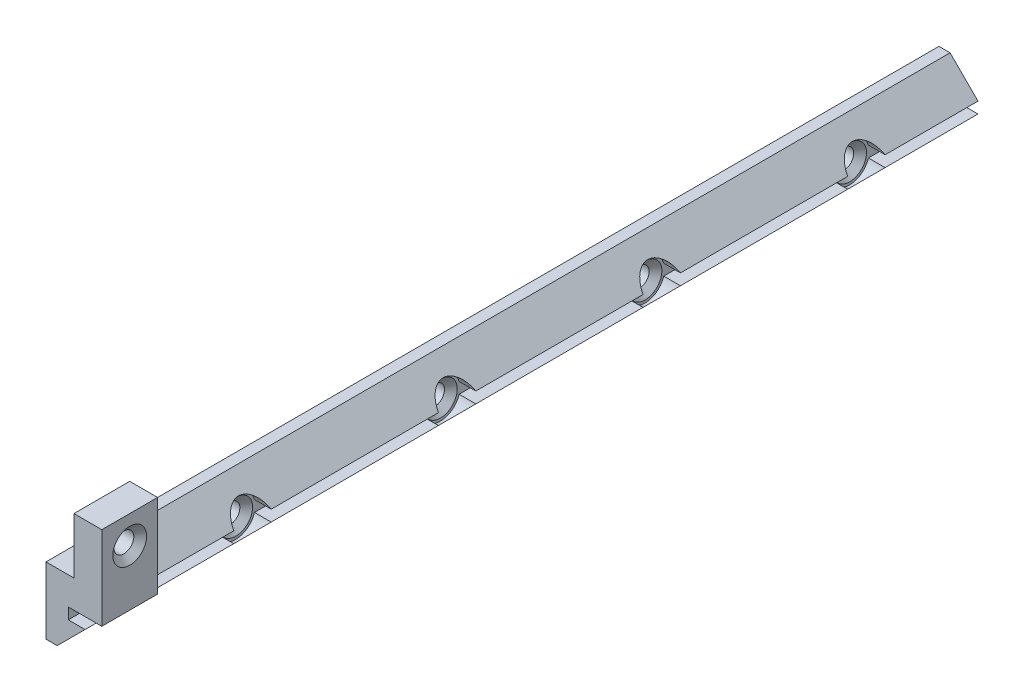
ISO-10303-21;
HEADER;
FILE_DESCRIPTION(('STEP AP214'),'2;1');
FILE_NAME('part.step','',(''),(''),'','','');
FILE_SCHEMA(('AUTOMOTIVE_DESIGN { 1 0 10303 214 1 1 1 1 }'));
ENDSEC;
DATA;
#1=APPLICATION_CONTEXT('core data for automotive mechanical design processes');
#2=APPLICATION_PROTOCOL_DEFINITION('international standard','automotive_design',2000,#1);
#3=PRODUCT_CONTEXT('',#1,'mechanical');
#4=PRODUCT('Part','Part','',(#3));
#5=PRODUCT_RELATED_PRODUCT_CATEGORY('part','',(#4));
#6=PRODUCT_DEFINITION_FORMATION('','',#4);
#7=PRODUCT_DEFINITION_CONTEXT('part definition',#1,'design');
#8=PRODUCT_DEFINITION('design','',#6,#7);
#9=PRODUCT_DEFINITION_SHAPE('','',#8);
#10=(LENGTH_UNIT() NAMED_UNIT(*) SI_UNIT(.MILLI.,.METRE.));
#11=(NAMED_UNIT(*) PLANE_ANGLE_UNIT() SI_UNIT($,.RADIAN.));
#12=(NAMED_UNIT(*) SI_UNIT($,.STERADIAN.) SOLID_ANGLE_UNIT());
#13=UNCERTAINTY_MEASURE_WITH_UNIT(LENGTH_MEASURE(1.E-05),#10,'distance_accuracy_value','');
#14=(GEOMETRIC_REPRESENTATION_CONTEXT(3) GLOBAL_UNCERTAINTY_ASSIGNED_CONTEXT((#13)) GLOBAL_UNIT_ASSIGNED_CONTEXT((#10,
#11,#12)) REPRESENTATION_CONTEXT('',''));
#15=CARTESIAN_POINT('',(0.,0.,0.));
#16=DIRECTION('',(0.,0.,1.));
#17=DIRECTION('',(1.,0.,0.));
#18=AXIS2_PLACEMENT_3D('',#15,#16,#17);
#19=CARTESIAN_POINT('',(2.,-0.5,75.));
#20=DIRECTION('',(0.,-1.,0.));
#21=DIRECTION('',(0.,0.,-1.));
#22=AXIS2_PLACEMENT_3D('',#19,#20,#21);
#23=PLANE('',#22);
#24=DIRECTION('',(1.,0.,0.));
#25=VECTOR('',#24,1.);
#26=CARTESIAN_POINT('',(-4.94974746830583,-0.5,8.32295901687516));
#27=LINE('',#26,#25);
#28=CARTESIAN_POINT('',(0.,-0.5,8.32295901687516));
#29=VERTEX_POINT('',#28);
#30=CARTESIAN_POINT('',(1.49999999999995,-0.5,8.32295901687516));
#31=VERTEX_POINT('',#30);
#32=EDGE_CURVE('E325',#29,#31,#27,.T.);
#33=ORIENTED_EDGE('',*,*,#32,.T.);
#34=DIRECTION('',(0.,0.,1.));
#35=VECTOR('',#34,1.);
#36=CARTESIAN_POINT('',(1.49999999999995,-0.5,75.));
#37=LINE('',#36,#35);
#38=CARTESIAN_POINT('',(1.49999999999995,-0.5,0.));
#39=VERTEX_POINT('',#38);
#40=EDGE_CURVE('E419',#31,#39,#37,.F.);
#41=ORIENTED_EDGE('',*,*,#40,.T.);
#42=DIRECTION('',(-1.,0.,0.));
#43=VECTOR('',#42,1.);
#44=CARTESIAN_POINT('',(2.,-0.5,0.));
#45=LINE('',#44,#43);
#46=CARTESIAN_POINT('',(0.,-0.5,0.));
#47=VERTEX_POINT('',#46);
#48=EDGE_CURVE('E362',#39,#47,#45,.T.);
#49=ORIENTED_EDGE('',*,*,#48,.T.);
#50=DIRECTION('',(0.,0.,-1.));
#51=VECTOR('',#50,1.);
#52=CARTESIAN_POINT('',(0.,-0.5,75.));
#53=LINE('',#52,#51);
#54=EDGE_CURVE('E252',#29,#47,#53,.T.);
#55=ORIENTED_EDGE('',*,*,#54,.F.);
#56=EDGE_LOOP('',(#33,#41,#49,#55));
#57=FACE_BOUND('',#56,.T.);
#58=ADVANCED_FACE('F37',(#57),#23,.F.);
#59=CARTESIAN_POINT('',(2.,0.5,75.));
#60=DIRECTION('',(0.,1.,0.));
#61=DIRECTION('',(-1.,0.,0.));
#62=AXIS2_PLACEMENT_3D('',#59,#60,#61);
#63=PLANE('',#62);
#64=DIRECTION('',(1.,0.,0.));
#65=VECTOR('',#64,1.);
#66=CARTESIAN_POINT('',(-4.94974746830583,0.500000000000001,11.6770609831248));
#67=LINE('',#66,#65);
#68=CARTESIAN_POINT('',(0.,0.500000000000001,11.6770609831248));
#69=VERTEX_POINT('',#68);
#70=CARTESIAN_POINT('',(1.49999999999997,0.500000000000001,11.6770609831248));
#71=VERTEX_POINT('',#70);
#72=EDGE_CURVE('E399',#69,#71,#67,.T.);
#73=ORIENTED_EDGE('',*,*,#72,.T.);
#74=DIRECTION('',(0.,0.,-1.));
#75=VECTOR('',#74,1.);
#76=CARTESIAN_POINT('',(1.49999999999997,0.5,75.));
#77=LINE('',#76,#75);
#78=CARTESIAN_POINT('',(1.49999999999997,0.500000000000001,26.6562890168752));
#79=VERTEX_POINT('',#78);
#80=EDGE_CURVE('E499',#71,#79,#77,.F.);
#81=ORIENTED_EDGE('',*,*,#80,.T.);
#82=DIRECTION('',(1.,0.,0.));
#83=VECTOR('',#82,1.);
#84=CARTESIAN_POINT('',(-4.94974746830583,0.500000000000001,26.6562890168752));
#85=LINE('',#84,#83);
#86=CARTESIAN_POINT('',(0.,0.5,26.6562890168752));
#87=VERTEX_POINT('',#86);
#88=EDGE_CURVE('E392',#79,#87,#85,.F.);
#89=ORIENTED_EDGE('',*,*,#88,.T.);
#90=DIRECTION('',(0.,0.,-1.));
#91=VECTOR('',#90,1.);
#92=CARTESIAN_POINT('',(0.,0.5,75.));
#93=LINE('',#92,#91);
#94=EDGE_CURVE('E540',#87,#69,#93,.T.);
#95=ORIENTED_EDGE('',*,*,#94,.T.);
#96=EDGE_LOOP('',(#73,#81,#89,#95));
#97=FACE_BOUND('',#96,.T.);
#98=ADVANCED_FACE('F537',(#97),#63,.F.);
#99=DIRECTION('',(1.,0.,0.));
#100=VECTOR('',#99,1.);
#101=CARTESIAN_POINT('',(-4.94974746830583,-0.5,26.6562890168752));
#102=LINE('',#101,#100);
#103=CARTESIAN_POINT('',(0.,-0.5,26.6562890168752));
#104=VERTEX_POINT('',#103);
#105=CARTESIAN_POINT('',(1.49999999999995,-0.5,26.6562890168752));
#106=VERTEX_POINT('',#105);
#107=EDGE_CURVE('E334',#104,#106,#102,.T.);
#108=ORIENTED_EDGE('',*,*,#107,.T.);
#109=DIRECTION('',(0.,0.,1.));
#110=VECTOR('',#109,1.);
#111=CARTESIAN_POINT('',(1.49999999999995,-0.5,75.));
#112=LINE('',#111,#110);
#113=CARTESIAN_POINT('',(1.49999999999995,-0.5,11.6770609831248));
#114=VERTEX_POINT('',#113);
#115=EDGE_CURVE('E415',#106,#114,#112,.F.);
#116=ORIENTED_EDGE('',*,*,#115,.T.);
#117=DIRECTION('',(1.,0.,0.));
#118=VECTOR('',#117,1.);
#119=CARTESIAN_POINT('',(-4.94974746830583,-0.5,11.6770609831248));
#120=LINE('',#119,#118);
#121=CARTESIAN_POINT('',(0.,-0.5,11.6770609831248));
#122=VERTEX_POINT('',#121);
#123=EDGE_CURVE('E322',#114,#122,#120,.F.);
#124=ORIENTED_EDGE('',*,*,#123,.T.);
#125=EDGE_CURVE('E659',#104,#122,#53,.T.);
#126=ORIENTED_EDGE('',*,*,#125,.F.);
#127=EDGE_LOOP('',(#108,#116,#124,#126));
#128=FACE_BOUND('',#127,.T.);
#129=ADVANCED_FACE('F616',(#128),#23,.F.);
#130=DIRECTION('',(1.,0.,0.));
#131=VECTOR('',#130,1.);
#132=CARTESIAN_POINT('',(-4.94974746830583,0.500000000000001,30.0103909831248));
#133=LINE('',#132,#131);
#134=CARTESIAN_POINT('',(0.,0.500000000000001,30.0103909831248));
#135=VERTEX_POINT('',#134);
#136=CARTESIAN_POINT('',(1.49999999999997,0.500000000000001,30.0103909831248));
#137=VERTEX_POINT('',#136);
#138=EDGE_CURVE('E394',#135,#137,#133,.T.);
#139=ORIENTED_EDGE('',*,*,#138,.T.);
#140=DIRECTION('',(0.,0.,-1.));
#141=VECTOR('',#140,1.);
#142=CARTESIAN_POINT('',(1.49999999999997,0.5,75.));
#143=LINE('',#142,#141);
#144=CARTESIAN_POINT('',(1.49999999999997,0.500000000000001,44.9896190168752));
#145=VERTEX_POINT('',#144);
#146=EDGE_CURVE('E503',#137,#145,#143,.F.);
#147=ORIENTED_EDGE('',*,*,#146,.T.);
#148=DIRECTION('',(1.,0.,0.));
#149=VECTOR('',#148,1.);
#150=CARTESIAN_POINT('',(-4.94974746830583,0.500000000000001,44.9896190168752));
#151=LINE('',#150,#149);
#152=CARTESIAN_POINT('',(0.,0.5,44.9896190168752));
#153=VERTEX_POINT('',#152);
#154=EDGE_CURVE('E387',#145,#153,#151,.F.);
#155=ORIENTED_EDGE('',*,*,#154,.T.);
#156=EDGE_CURVE('E543',#153,#135,#93,.T.);
#157=ORIENTED_EDGE('',*,*,#156,.T.);
#158=EDGE_LOOP('',(#139,#147,#155,#157));
#159=FACE_BOUND('',#158,.T.);
#160=ADVANCED_FACE('F621',(#159),#63,.F.);
#161=DIRECTION('',(1.,0.,0.));
#162=VECTOR('',#161,1.);
#163=CARTESIAN_POINT('',(-4.94974746830583,-0.5,44.9896190168752));
#164=LINE('',#163,#162);
#165=CARTESIAN_POINT('',(0.,-0.5,44.9896190168752));
#166=VERTEX_POINT('',#165);
#167=CARTESIAN_POINT('',(1.49999999999995,-0.5,44.9896190168752));
#168=VERTEX_POINT('',#167);
#169=EDGE_CURVE('E343',#166,#168,#164,.T.);
#170=ORIENTED_EDGE('',*,*,#169,.T.);
#171=DIRECTION('',(0.,0.,1.));
#172=VECTOR('',#171,1.);
#173=CARTESIAN_POINT('',(1.49999999999995,-0.5,75.));
#174=LINE('',#173,#172);
#175=CARTESIAN_POINT('',(1.49999999999995,-0.5,30.0103909831248));
#176=VERTEX_POINT('',#175);
#177=EDGE_CURVE('E402',#168,#176,#174,.F.);
#178=ORIENTED_EDGE('',*,*,#177,.T.);
#179=DIRECTION('',(1.,0.,0.));
#180=VECTOR('',#179,1.);
#181=CARTESIAN_POINT('',(-4.94974746830583,-0.5,30.0103909831248));
#182=LINE('',#181,#180);
#183=CARTESIAN_POINT('',(0.,-0.5,30.0103909831248));
#184=VERTEX_POINT('',#183);
#185=EDGE_CURVE('E332',#176,#184,#182,.F.);
#186=ORIENTED_EDGE('',*,*,#185,.T.);
#187=EDGE_CURVE('E649',#166,#184,#53,.T.);
#188=ORIENTED_EDGE('',*,*,#187,.F.);
#189=EDGE_LOOP('',(#170,#178,#186,#188));
#190=FACE_BOUND('',#189,.T.);
#191=ADVANCED_FACE('F626',(#190),#23,.F.);
#192=DIRECTION('',(1.,0.,0.));
#193=VECTOR('',#192,1.);
#194=CARTESIAN_POINT('',(-4.94974746830583,0.500000000000001,48.3437209831248));
#195=LINE('',#194,#193);
#196=CARTESIAN_POINT('',(0.,0.500000000000001,48.3437209831248));
#197=VERTEX_POINT('',#196);
#198=CARTESIAN_POINT('',(1.49999999999997,0.500000000000001,48.3437209831248));
#199=VERTEX_POINT('',#198);
#200=EDGE_CURVE('E389',#197,#199,#195,.T.);
#201=ORIENTED_EDGE('',*,*,#200,.T.);
#202=DIRECTION('',(0.,0.,-1.));
#203=VECTOR('',#202,1.);
#204=CARTESIAN_POINT('',(1.49999999999997,0.5,75.));
#205=LINE('',#204,#203);
#206=CARTESIAN_POINT('',(1.49999999999997,0.500000000000001,63.3229490168752));
#207=VERTEX_POINT('',#206);
#208=EDGE_CURVE('E507',#199,#207,#205,.F.);
#209=ORIENTED_EDGE('',*,*,#208,.T.);
#210=DIRECTION('',(1.,0.,0.));
#211=VECTOR('',#210,1.);
#212=CARTESIAN_POINT('',(-4.94974746830583,0.500000000000001,63.3229490168752));
#213=LINE('',#212,#211);
#214=CARTESIAN_POINT('',(0.,0.5,63.3229490168752));
#215=VERTEX_POINT('',#214);
#216=EDGE_CURVE('E380',#207,#215,#213,.F.);
#217=ORIENTED_EDGE('',*,*,#216,.T.);
#218=EDGE_CURVE('E372',#215,#197,#93,.T.);
#219=ORIENTED_EDGE('',*,*,#218,.T.);
#220=EDGE_LOOP('',(#201,#209,#217,#219));
#221=FACE_BOUND('',#220,.T.);
#222=ADVANCED_FACE('F552',(#221),#63,.F.);
#223=DIRECTION('',(1.,0.,0.));
#224=VECTOR('',#223,1.);
#225=CARTESIAN_POINT('',(-4.94974746830583,-0.5,63.3229490168752));
#226=LINE('',#225,#224);
#227=CARTESIAN_POINT('',(0.,-0.499999999999997,63.3229490168752));
#228=VERTEX_POINT('',#227);
#229=CARTESIAN_POINT('',(1.49999999999995,-0.5,63.3229490168752));
#230=VERTEX_POINT('',#229);
#231=EDGE_CURVE('E351',#228,#230,#226,.T.);
#232=ORIENTED_EDGE('',*,*,#231,.T.);
#233=DIRECTION('',(0.,0.,1.));
#234=VECTOR('',#233,1.);
#235=CARTESIAN_POINT('',(1.49999999999995,-0.5,75.));
#236=LINE('',#235,#234);
#237=CARTESIAN_POINT('',(1.49999999999995,-0.5,48.3437209831248));
#238=VERTEX_POINT('',#237);
#239=EDGE_CURVE('E487',#230,#238,#236,.F.);
#240=ORIENTED_EDGE('',*,*,#239,.T.);
#241=DIRECTION('',(1.,0.,0.));
#242=VECTOR('',#241,1.);
#243=CARTESIAN_POINT('',(-4.94974746830583,-0.5,48.3437209831248));
#244=LINE('',#243,#242);
#245=CARTESIAN_POINT('',(0.,-0.5,48.3437209831248));
#246=VERTEX_POINT('',#245);
#247=EDGE_CURVE('E341',#238,#246,#244,.F.);
#248=ORIENTED_EDGE('',*,*,#247,.T.);
#249=EDGE_CURVE('E250',#228,#246,#53,.T.);
#250=ORIENTED_EDGE('',*,*,#249,.F.);
#251=EDGE_LOOP('',(#232,#240,#248,#250));
#252=FACE_BOUND('',#251,.T.);
#253=ADVANCED_FACE('F628',(#252),#23,.F.);
#254=DIRECTION('',(1.,0.,0.));
#255=VECTOR('',#254,1.);
#256=CARTESIAN_POINT('',(-4.94974746830583,0.500000000000001,66.6770509831248));
#257=LINE('',#256,#255);
#258=CARTESIAN_POINT('',(0.,0.499999999999999,66.6770509831248));
#259=VERTEX_POINT('',#258);
#260=CARTESIAN_POINT('',(1.49999999999997,0.500000000000001,66.6770509831248));
#261=VERTEX_POINT('',#260);
#262=EDGE_CURVE('E383',#259,#261,#257,.T.);
#263=ORIENTED_EDGE('',*,*,#262,.T.);
#264=DIRECTION('',(0.,0.,-1.));
#265=VECTOR('',#264,1.);
#266=CARTESIAN_POINT('',(1.49999999999997,0.5,75.));
#267=LINE('',#266,#265);
#268=CARTESIAN_POINT('',(1.49999999999997,0.5,75.));
#269=VERTEX_POINT('',#268);
#270=EDGE_CURVE('E438',#261,#269,#267,.F.);
#271=ORIENTED_EDGE('',*,*,#270,.T.);
#272=DIRECTION('',(1.,0.,0.));
#273=VECTOR('',#272,1.);
#274=CARTESIAN_POINT('',(3.,0.5,75.));
#275=LINE('',#274,#273);
#276=CARTESIAN_POINT('',(3.,0.5,75.));
#277=VERTEX_POINT('',#276);
#278=EDGE_CURVE('E283',#269,#277,#275,.T.);
#279=ORIENTED_EDGE('',*,*,#278,.T.);
#280=DIRECTION('',(0.,0.,-1.));
#281=VECTOR('',#280,1.);
#282=CARTESIAN_POINT('',(3.,0.5,80.));
#283=LINE('',#282,#281);
#284=CARTESIAN_POINT('',(3.,0.5,80.));
#285=VERTEX_POINT('',#284);
#286=EDGE_CURVE('E293',#285,#277,#283,.T.);
#287=ORIENTED_EDGE('',*,*,#286,.F.);
#288=DIRECTION('',(1.,0.,0.));
#289=VECTOR('',#288,1.);
#290=CARTESIAN_POINT('',(3.,0.5,80.));
#291=LINE('',#290,#289);
#292=CARTESIAN_POINT('',(0.,0.5,80.));
#293=VERTEX_POINT('',#292);
#294=EDGE_CURVE('E258',#293,#285,#291,.T.);
#295=ORIENTED_EDGE('',*,*,#294,.F.);
#296=EDGE_CURVE('E257',#293,#259,#93,.T.);
#297=ORIENTED_EDGE('',*,*,#296,.T.);
#298=EDGE_LOOP('',(#263,#271,#279,#287,#295,#297));
#299=FACE_BOUND('',#298,.T.);
#300=ADVANCED_FACE('F568',(#299),#63,.F.);
#301=CARTESIAN_POINT('',(-2.,3.,75.));
#302=DIRECTION('',(0.,-1.,0.));
#303=DIRECTION('',(0.,0.,-1.));
#304=AXIS2_PLACEMENT_3D('',#301,#302,#303);
#305=PLANE('',#304);
#306=DIRECTION('',(0.,0.,-1.));
#307=VECTOR('',#306,1.);
#308=CARTESIAN_POINT('',(-2.,3.,75.));
#309=LINE('',#308,#307);
#310=CARTESIAN_POINT('',(-2.,3.,80.));
#311=VERTEX_POINT('',#310);
#312=CARTESIAN_POINT('',(-2.,3.,0.));
#313=VERTEX_POINT('',#312);
#314=EDGE_CURVE('E376',#311,#313,#309,.T.);
#315=ORIENTED_EDGE('',*,*,#314,.F.);
#316=DIRECTION('',(-1.,0.,0.));
#317=VECTOR('',#316,1.);
#318=CARTESIAN_POINT('',(-2.,3.,80.));
#319=LINE('',#318,#317);
#320=CARTESIAN_POINT('',(0.499999999999998,3.,80.));
#321=VERTEX_POINT('',#320);
#322=EDGE_CURVE('E269',#321,#311,#319,.T.);
#323=ORIENTED_EDGE('',*,*,#322,.F.);
#324=DIRECTION('',(0.,0.,-1.));
#325=VECTOR('',#324,1.);
#326=CARTESIAN_POINT('',(0.499999999999998,3.,80.));
#327=LINE('',#326,#325);
#328=CARTESIAN_POINT('',(0.499999999999998,3.,75.));
#329=VERTEX_POINT('',#328);
#330=EDGE_CURVE('E277',#321,#329,#327,.T.);
#331=ORIENTED_EDGE('',*,*,#330,.T.);
#332=DIRECTION('',(-1.,0.,0.));
#333=VECTOR('',#332,1.);
#334=CARTESIAN_POINT('',(-2.,3.,75.));
#335=LINE('',#334,#333);
#336=CARTESIAN_POINT('',(-1.00000000000005,3.,75.));
#337=VERTEX_POINT('',#336);
#338=EDGE_CURVE('E239',#329,#337,#335,.T.);
#339=ORIENTED_EDGE('',*,*,#338,.T.);
#340=DIRECTION('',(0.,0.,-1.));
#341=VECTOR('',#340,1.);
#342=CARTESIAN_POINT('',(-1.00000000000005,3.,75.));
#343=LINE('',#342,#341);
#344=CARTESIAN_POINT('',(-1.00000000000005,3.,0.));
#345=VERTEX_POINT('',#344);
#346=EDGE_CURVE('E494',#337,#345,#343,.T.);
#347=ORIENTED_EDGE('',*,*,#346,.T.);
#348=DIRECTION('',(-1.,0.,0.));
#349=VECTOR('',#348,1.);
#350=CARTESIAN_POINT('',(-2.,3.,0.));
#351=LINE('',#350,#349);
#352=EDGE_CURVE('E355',#345,#313,#351,.T.);
#353=ORIENTED_EDGE('',*,*,#352,.T.);
#354=EDGE_LOOP('',(#315,#323,#331,#339,#347,#353));
#355=FACE_BOUND('',#354,.T.);
#356=ADVANCED_FACE('F515',(#355),#305,.F.);
#357=CARTESIAN_POINT('',(-2.,-3.,75.));
#358=DIRECTION('',(1.,0.,0.));
#359=DIRECTION('',(0.,0.,-1.));
#360=AXIS2_PLACEMENT_3D('',#357,#358,#359);
#361=PLANE('',#360);
#362=CARTESIAN_POINT('',(-2.,0.,65.));
#363=DIRECTION('',(1.,0.,0.));
#364=DIRECTION('',(0.,0.,-1.));
#365=AXIS2_PLACEMENT_3D('',#362,#363,#364);
#366=CIRCLE('',#365,0.888999999999999);
#367=CARTESIAN_POINT('',(-2.,0.,64.111));
#368=VERTEX_POINT('',#367);
#369=EDGE_CURVE('E297',#368,#368,#366,.T.);
#370=ORIENTED_EDGE('',*,*,#369,.T.);
#371=EDGE_LOOP('',(#370));
#372=FACE_BOUND('',#371,.T.);
#373=CARTESIAN_POINT('',(-2.,0.,10.00001));
#374=DIRECTION('',(1.,0.,0.));
#375=DIRECTION('',(0.,0.,-1.));
#376=AXIS2_PLACEMENT_3D('',#373,#374,#375);
#377=CIRCLE('',#376,0.888999999999999);
#378=CARTESIAN_POINT('',(-2.,0.,9.11101));
#379=VERTEX_POINT('',#378);
#380=EDGE_CURVE('E304',#379,#379,#377,.T.);
#381=ORIENTED_EDGE('',*,*,#380,.T.);
#382=EDGE_LOOP('',(#381));
#383=FACE_BOUND('',#382,.T.);
#384=CARTESIAN_POINT('',(-2.,0.,46.66667));
#385=DIRECTION('',(1.,0.,0.));
#386=DIRECTION('',(0.,0.,-1.));
#387=AXIS2_PLACEMENT_3D('',#384,#385,#386);
#388=CIRCLE('',#387,0.888999999999999);
#389=CARTESIAN_POINT('',(-2.,0.,45.77767));
#390=VERTEX_POINT('',#389);
#391=EDGE_CURVE('E311',#390,#390,#388,.T.);
#392=ORIENTED_EDGE('',*,*,#391,.T.);
#393=EDGE_LOOP('',(#392));
#394=FACE_BOUND('',#393,.T.);
#395=CARTESIAN_POINT('',(-2.,0.,28.33334));
#396=DIRECTION('',(1.,0.,0.));
#397=DIRECTION('',(0.,0.,-1.));
#398=AXIS2_PLACEMENT_3D('',#395,#396,#397);
#399=CIRCLE('',#398,0.888999999999999);
#400=CARTESIAN_POINT('',(-2.,0.,27.44434));
#401=VERTEX_POINT('',#400);
#402=EDGE_CURVE('E318',#401,#401,#399,.T.);
#403=ORIENTED_EDGE('',*,*,#402,.T.);
#404=EDGE_LOOP('',(#403));
#405=FACE_BOUND('',#404,.T.);
#406=DIRECTION('',(0.,-1.,0.));
#407=VECTOR('',#406,1.);
#408=CARTESIAN_POINT('',(-2.,-3.,0.));
#409=LINE('',#408,#407);
#410=CARTESIAN_POINT('',(-2.,-3.,0.));
#411=VERTEX_POINT('',#410);
#412=EDGE_CURVE('E357',#313,#411,#409,.T.);
#413=ORIENTED_EDGE('',*,*,#412,.T.);
#414=DIRECTION('',(0.,0.,-1.));
#415=VECTOR('',#414,1.);
#416=CARTESIAN_POINT('',(-2.,-3.,75.));
#417=LINE('',#416,#415);
#418=CARTESIAN_POINT('',(-2.,-3.,80.));
#419=VERTEX_POINT('',#418);
#420=EDGE_CURVE('E249',#419,#411,#417,.T.);
#421=ORIENTED_EDGE('',*,*,#420,.F.);
#422=DIRECTION('',(0.,-1.,0.));
#423=VECTOR('',#422,1.);
#424=CARTESIAN_POINT('',(-2.,3.,80.));
#425=LINE('',#424,#423);
#426=EDGE_CURVE('E272',#311,#419,#425,.T.);
#427=ORIENTED_EDGE('',*,*,#426,.F.);
#428=ORIENTED_EDGE('',*,*,#314,.T.);
#429=EDGE_LOOP('',(#413,#421,#427,#428));
#430=FACE_BOUND('',#429,.T.);
#431=ADVANCED_FACE('F468',(#372,#383,#394,#405,#430),#361,.F.);
#432=CARTESIAN_POINT('',(-2.,-3.,75.));
#433=DIRECTION('',(0.,1.,0.));
#434=DIRECTION('',(0.,0.,1.));
#435=AXIS2_PLACEMENT_3D('',#432,#433,#434);
#436=PLANE('',#435);
#437=DIRECTION('',(0.,0.,1.));
#438=VECTOR('',#437,1.);
#439=CARTESIAN_POINT('',(-1.00000000000002,-3.,75.));
#440=LINE('',#439,#438);
#441=CARTESIAN_POINT('',(-1.00000000000002,-3.,0.));
#442=VERTEX_POINT('',#441);
#443=CARTESIAN_POINT('',(-1.00000000000002,-3.,75.));
#444=VERTEX_POINT('',#443);
#445=EDGE_CURVE('E425',#442,#444,#440,.T.);
#446=ORIENTED_EDGE('',*,*,#445,.T.);
#447=DIRECTION('',(0.,0.,1.));
#448=VECTOR('',#447,1.);
#449=CARTESIAN_POINT('',(-1.00000000000002,-3.,75.));
#450=LINE('',#449,#448);
#451=CARTESIAN_POINT('',(-1.00000000000002,-3.,80.));
#452=VERTEX_POINT('',#451);
#453=EDGE_CURVE('E46',#444,#452,#450,.T.);
#454=ORIENTED_EDGE('',*,*,#453,.T.);
#455=DIRECTION('',(1.,0.,0.));
#456=VECTOR('',#455,1.);
#457=CARTESIAN_POINT('',(-2.,-3.,80.));
#458=LINE('',#457,#456);
#459=EDGE_CURVE('E275',#419,#452,#458,.T.);
#460=ORIENTED_EDGE('',*,*,#459,.F.);
#461=ORIENTED_EDGE('',*,*,#420,.T.);
#462=DIRECTION('',(1.,0.,0.));
#463=VECTOR('',#462,1.);
#464=CARTESIAN_POINT('',(-2.,-3.,0.));
#465=LINE('',#464,#463);
#466=EDGE_CURVE('E359',#411,#442,#465,.T.);
#467=ORIENTED_EDGE('',*,*,#466,.T.);
#468=EDGE_LOOP('',(#446,#454,#460,#461,#467));
#469=FACE_BOUND('',#468,.T.);
#470=ADVANCED_FACE('F463',(#469),#436,.F.);
#471=DIRECTION('',(-1.,0.,0.));
#472=VECTOR('',#471,1.);
#473=CARTESIAN_POINT('',(2.,-0.5,80.));
#474=LINE('',#473,#472);
#475=CARTESIAN_POINT('',(1.49999999999995,-0.5,80.));
#476=VERTEX_POINT('',#475);
#477=CARTESIAN_POINT('',(0.,-0.5,80.));
#478=VERTEX_POINT('',#477);
#479=EDGE_CURVE('E232',#476,#478,#474,.T.);
#480=ORIENTED_EDGE('',*,*,#479,.F.);
#481=DIRECTION('',(0.,0.,1.));
#482=VECTOR('',#481,1.);
#483=CARTESIAN_POINT('',(1.49999999999995,-0.5,80.));
#484=LINE('',#483,#482);
#485=CARTESIAN_POINT('',(1.49999999999995,-0.5,75.));
#486=VERTEX_POINT('',#485);
#487=EDGE_CURVE('E441',#476,#486,#484,.F.);
#488=ORIENTED_EDGE('',*,*,#487,.T.);
#489=DIRECTION('',(0.,0.,1.));
#490=VECTOR('',#489,1.);
#491=CARTESIAN_POINT('',(1.49999999999995,-0.5,75.));
#492=LINE('',#491,#490);
#493=CARTESIAN_POINT('',(1.49999999999995,-0.5,66.6770509831248));
#494=VERTEX_POINT('',#493);
#495=EDGE_CURVE('E447',#486,#494,#492,.F.);
#496=ORIENTED_EDGE('',*,*,#495,.T.);
#497=DIRECTION('',(1.,0.,0.));
#498=VECTOR('',#497,1.);
#499=CARTESIAN_POINT('',(-4.94974746830583,-0.5,66.6770509831248));
#500=LINE('',#499,#498);
#501=CARTESIAN_POINT('',(0.,-0.5,66.6770509831248));
#502=VERTEX_POINT('',#501);
#503=EDGE_CURVE('E245',#494,#502,#500,.F.);
#504=ORIENTED_EDGE('',*,*,#503,.T.);
#505=EDGE_CURVE('E242',#478,#502,#53,.T.);
#506=ORIENTED_EDGE('',*,*,#505,.F.);
#507=EDGE_LOOP('',(#480,#488,#496,#504,#506));
#508=FACE_BOUND('',#507,.T.);
#509=ADVANCED_FACE('F243',(#508),#23,.F.);
#510=CARTESIAN_POINT('',(0.,0.5,75.));
#511=DIRECTION('',(-1.,0.,0.));
#512=DIRECTION('',(0.,0.,1.));
#513=AXIS2_PLACEMENT_3D('',#510,#511,#512);
#514=PLANE('',#513);
#515=CARTESIAN_POINT('',(0.,0.,65.));
#516=DIRECTION('',(1.,0.,0.));
#517=DIRECTION('',(0.,0.,-1.));
#518=AXIS2_PLACEMENT_3D('',#515,#516,#517);
#519=CIRCLE('',#518,1.5113);
#520=CARTESIAN_POINT('',(0.,0.,63.4887));
#521=VERTEX_POINT('',#520);
#522=EDGE_CURVE('E288',#521,#521,#519,.T.);
#523=ORIENTED_EDGE('',*,*,#522,.F.);
#524=EDGE_LOOP('',(#523));
#525=FACE_BOUND('',#524,.T.);
#526=CARTESIAN_POINT('',(0.,0.,10.00001));
#527=DIRECTION('',(1.,0.,0.));
#528=DIRECTION('',(0.,0.,-1.));
#529=AXIS2_PLACEMENT_3D('',#526,#527,#528);
#530=CIRCLE('',#529,1.5113);
#531=CARTESIAN_POINT('',(0.,0.,8.48871));
#532=VERTEX_POINT('',#531);
#533=EDGE_CURVE('E298',#532,#532,#530,.T.);
#534=ORIENTED_EDGE('',*,*,#533,.F.);
#535=EDGE_LOOP('',(#534));
#536=FACE_BOUND('',#535,.T.);
#537=CARTESIAN_POINT('',(0.,0.,46.66667));
#538=DIRECTION('',(1.,0.,0.));
#539=DIRECTION('',(0.,0.,-1.));
#540=AXIS2_PLACEMENT_3D('',#537,#538,#539);
#541=CIRCLE('',#540,1.5113);
#542=CARTESIAN_POINT('',(0.,0.,45.15537));
#543=VERTEX_POINT('',#542);
#544=EDGE_CURVE('E305',#543,#543,#541,.T.);
#545=ORIENTED_EDGE('',*,*,#544,.F.);
#546=EDGE_LOOP('',(#545));
#547=FACE_BOUND('',#546,.T.);
#548=CARTESIAN_POINT('',(0.,0.,28.33334));
#549=DIRECTION('',(1.,0.,0.));
#550=DIRECTION('',(0.,0.,-1.));
#551=AXIS2_PLACEMENT_3D('',#548,#549,#550);
#552=CIRCLE('',#551,1.5113);
#553=CARTESIAN_POINT('',(0.,0.,26.82204));
#554=VERTEX_POINT('',#553);
#555=EDGE_CURVE('E312',#554,#554,#552,.T.);
#556=ORIENTED_EDGE('',*,*,#555,.F.);
#557=EDGE_LOOP('',(#556));
#558=FACE_BOUND('',#557,.T.);
#559=ORIENTED_EDGE('',*,*,#125,.T.);
#560=CARTESIAN_POINT('',(0.,0.,10.00001));
#561=DIRECTION('',(-1.,0.,0.));
#562=DIRECTION('',(0.,0.,1.));
#563=AXIS2_PLACEMENT_3D('',#560,#561,#562);
#564=CIRCLE('',#563,1.75);
#565=EDGE_CURVE('E319',#122,#29,#564,.F.);
#566=ORIENTED_EDGE('',*,*,#565,.T.);
#567=ORIENTED_EDGE('',*,*,#54,.T.);
#568=DIRECTION('',(0.,1.,0.));
#569=VECTOR('',#568,1.);
#570=CARTESIAN_POINT('',(0.,0.5,0.));
#571=LINE('',#570,#569);
#572=CARTESIAN_POINT('',(0.,0.5,0.));
#573=VERTEX_POINT('',#572);
#574=EDGE_CURVE('E364',#47,#573,#571,.T.);
#575=ORIENTED_EDGE('',*,*,#574,.T.);
#576=CARTESIAN_POINT('',(0.,0.5,8.32295901687516));
#577=VERTEX_POINT('',#576);
#578=EDGE_CURVE('E370',#577,#573,#93,.T.);
#579=ORIENTED_EDGE('',*,*,#578,.F.);
#580=EDGE_CURVE('E323',#577,#69,#564,.F.);
#581=ORIENTED_EDGE('',*,*,#580,.T.);
#582=ORIENTED_EDGE('',*,*,#94,.F.);
#583=CARTESIAN_POINT('',(0.,0.,28.33334));
#584=DIRECTION('',(-1.,0.,0.));
#585=DIRECTION('',(0.,0.,1.));
#586=AXIS2_PLACEMENT_3D('',#583,#584,#585);
#587=CIRCLE('',#586,1.75);
#588=EDGE_CURVE('E328',#87,#135,#587,.F.);
#589=ORIENTED_EDGE('',*,*,#588,.T.);
#590=ORIENTED_EDGE('',*,*,#156,.F.);
#591=CARTESIAN_POINT('',(0.,0.,46.66667));
#592=DIRECTION('',(-1.,0.,0.));
#593=DIRECTION('',(0.,0.,1.));
#594=AXIS2_PLACEMENT_3D('',#591,#592,#593);
#595=CIRCLE('',#594,1.75);
#596=EDGE_CURVE('E337',#153,#197,#595,.F.);
#597=ORIENTED_EDGE('',*,*,#596,.T.);
#598=ORIENTED_EDGE('',*,*,#218,.F.);
#599=CARTESIAN_POINT('',(0.,0.,65.));
#600=DIRECTION('',(-1.,0.,0.));
#601=DIRECTION('',(0.,0.,1.));
#602=AXIS2_PLACEMENT_3D('',#599,#600,#601);
#603=CIRCLE('',#602,1.75);
#604=EDGE_CURVE('E346',#215,#259,#603,.F.);
#605=ORIENTED_EDGE('',*,*,#604,.T.);
#606=ORIENTED_EDGE('',*,*,#296,.F.);
#607=DIRECTION('',(0.,1.,0.));
#608=VECTOR('',#607,1.);
#609=CARTESIAN_POINT('',(0.,0.5,80.));
#610=LINE('',#609,#608);
#611=EDGE_CURVE('E236',#478,#293,#610,.T.);
#612=ORIENTED_EDGE('',*,*,#611,.F.);
#613=ORIENTED_EDGE('',*,*,#505,.T.);
#614=EDGE_CURVE('E347',#502,#228,#603,.F.);
#615=ORIENTED_EDGE('',*,*,#614,.T.);
#616=ORIENTED_EDGE('',*,*,#249,.T.);
#617=EDGE_CURVE('E338',#246,#166,#595,.F.);
#618=ORIENTED_EDGE('',*,*,#617,.T.);
#619=ORIENTED_EDGE('',*,*,#187,.T.);
#620=EDGE_CURVE('E329',#184,#104,#587,.F.);
#621=ORIENTED_EDGE('',*,*,#620,.T.);
#622=EDGE_LOOP('',(#559,#566,#567,#575,#579,#581,#582,#589,#590,#597,#598,#605,#606,#612,#613,
#615,#616,#618,#619,#621));
#623=FACE_BOUND('',#622,.T.);
#624=ADVANCED_FACE('F254',(#525,#536,#547,#558,#623),#514,.F.);
#625=DIRECTION('',(1.,0.,0.));
#626=VECTOR('',#625,1.);
#627=CARTESIAN_POINT('',(2.,0.5,0.));
#628=LINE('',#627,#626);
#629=CARTESIAN_POINT('',(1.49999999999997,0.5,0.));
#630=VERTEX_POINT('',#629);
#631=EDGE_CURVE('E367',#573,#630,#628,.T.);
#632=ORIENTED_EDGE('',*,*,#631,.T.);
#633=DIRECTION('',(0.,0.,-1.));
#634=VECTOR('',#633,1.);
#635=CARTESIAN_POINT('',(1.49999999999997,0.5,75.));
#636=LINE('',#635,#634);
#637=CARTESIAN_POINT('',(1.49999999999997,0.500000000000001,8.32295901687516));
#638=VERTEX_POINT('',#637);
#639=EDGE_CURVE('E495',#630,#638,#636,.F.);
#640=ORIENTED_EDGE('',*,*,#639,.T.);
#641=DIRECTION('',(1.,0.,0.));
#642=VECTOR('',#641,1.);
#643=CARTESIAN_POINT('',(-4.94974746830583,0.500000000000001,8.32295901687516));
#644=LINE('',#643,#642);
#645=EDGE_CURVE('E397',#638,#577,#644,.F.);
#646=ORIENTED_EDGE('',*,*,#645,.T.);
#647=ORIENTED_EDGE('',*,*,#578,.T.);
#648=EDGE_LOOP('',(#632,#640,#646,#647));
#649=FACE_BOUND('',#648,.T.);
#650=ADVANCED_FACE('F523',(#649),#63,.F.);
#651=CARTESIAN_POINT('',(0.,0.,0.));
#652=DIRECTION('',(0.,0.,-1.));
#653=DIRECTION('',(-1.,0.,0.));
#654=AXIS2_PLACEMENT_3D('',#651,#652,#653);
#655=PLANE('',#654);
#656=ORIENTED_EDGE('',*,*,#48,.F.);
#657=DIRECTION('',(0.707106781186544,0.707106781186551,0.));
#658=VECTOR('',#657,1.);
#659=CARTESIAN_POINT('',(0.999999999999984,-0.999999999999973,0.));
#660=LINE('',#659,#658);
#661=EDGE_CURVE('E423',#39,#442,#660,.F.);
#662=ORIENTED_EDGE('',*,*,#661,.T.);
#663=ORIENTED_EDGE('',*,*,#466,.F.);
#664=ORIENTED_EDGE('',*,*,#412,.F.);
#665=ORIENTED_EDGE('',*,*,#352,.F.);
#666=DIRECTION('',(-0.707106781186551,0.707106781186544,0.));
#667=VECTOR('',#666,1.);
#668=CARTESIAN_POINT('',(0.999999999999979,0.999999999999989,0.));
#669=LINE('',#668,#667);
#670=EDGE_CURVE('E421',#345,#630,#669,.F.);
#671=ORIENTED_EDGE('',*,*,#670,.T.);
#672=ORIENTED_EDGE('',*,*,#631,.F.);
#673=ORIENTED_EDGE('',*,*,#574,.F.);
#674=EDGE_LOOP('',(#656,#662,#663,#664,#665,#671,#672,#673));
#675=FACE_BOUND('',#674,.T.);
#676=ADVANCED_FACE('F473',(#675),#655,.T.);
#677=CARTESIAN_POINT('',(-4.94974746830583,0.,65.));
#678=DIRECTION('',(1.,0.,0.));
#679=DIRECTION('',(0.,0.,-1.));
#680=AXIS2_PLACEMENT_3D('',#677,#678,#679);
#681=CYLINDRICAL_SURFACE('',#680,1.75);
#682=ORIENTED_EDGE('',*,*,#216,.F.);
#683=CARTESIAN_POINT('',(1.99999999999998,0.,65.));
#684=DIRECTION('',(-0.707106781186544,-0.707106781186551,0.));
#685=DIRECTION('',(0.707106781186551,-0.707106781186544,0.));
#686=AXIS2_PLACEMENT_3D('',#683,#684,#685);
#687=ELLIPSE('',#686,2.47487373415292,1.75);
#688=EDGE_CURVE('E442',#207,#261,#687,.F.);
#689=ORIENTED_EDGE('',*,*,#688,.T.);
#690=ORIENTED_EDGE('',*,*,#262,.F.);
#691=ORIENTED_EDGE('',*,*,#604,.F.);
#692=EDGE_LOOP('',(#682,#689,#690,#691));
#693=FACE_BOUND('',#692,.T.);
#694=ADVANCED_FACE('F565',(#693),#681,.F.);
#695=ORIENTED_EDGE('',*,*,#503,.F.);
#696=CARTESIAN_POINT('',(1.99999999999995,0.,65.));
#697=DIRECTION('',(-0.707106781186551,0.707106781186544,0.));
#698=DIRECTION('',(0.707106781186544,0.707106781186551,0.));
#699=AXIS2_PLACEMENT_3D('',#696,#697,#698);
#700=ELLIPSE('',#699,2.4748737341529,1.75);
#701=EDGE_CURVE('E449',#494,#230,#700,.F.);
#702=ORIENTED_EDGE('',*,*,#701,.T.);
#703=ORIENTED_EDGE('',*,*,#231,.F.);
#704=ORIENTED_EDGE('',*,*,#614,.F.);
#705=EDGE_LOOP('',(#695,#702,#703,#704));
#706=FACE_BOUND('',#705,.T.);
#707=ADVANCED_FACE('F484',(#706),#681,.F.);
#708=CARTESIAN_POINT('',(-4.94974746830583,0.,46.66667));
#709=DIRECTION('',(1.,0.,0.));
#710=DIRECTION('',(0.,0.,-1.));
#711=AXIS2_PLACEMENT_3D('',#708,#709,#710);
#712=CYLINDRICAL_SURFACE('',#711,1.75);
#713=ORIENTED_EDGE('',*,*,#154,.F.);
#714=CARTESIAN_POINT('',(1.99999999999998,0.,46.66667));
#715=DIRECTION('',(-0.707106781186544,-0.707106781186551,0.));
#716=DIRECTION('',(0.707106781186551,-0.707106781186544,0.));
#717=AXIS2_PLACEMENT_3D('',#714,#715,#716);
#718=ELLIPSE('',#717,2.47487373415292,1.75);
#719=EDGE_CURVE('E505',#145,#199,#718,.F.);
#720=ORIENTED_EDGE('',*,*,#719,.T.);
#721=ORIENTED_EDGE('',*,*,#200,.F.);
#722=ORIENTED_EDGE('',*,*,#596,.F.);
#723=EDGE_LOOP('',(#713,#720,#721,#722));
#724=FACE_BOUND('',#723,.T.);
#725=ADVANCED_FACE('F560',(#724),#712,.F.);
#726=ORIENTED_EDGE('',*,*,#247,.F.);
#727=CARTESIAN_POINT('',(1.99999999999995,0.,46.66667));
#728=DIRECTION('',(-0.707106781186551,0.707106781186544,0.));
#729=DIRECTION('',(0.707106781186544,0.707106781186551,0.));
#730=AXIS2_PLACEMENT_3D('',#727,#728,#729);
#731=ELLIPSE('',#730,2.4748737341529,1.75);
#732=EDGE_CURVE('E490',#238,#168,#731,.F.);
#733=ORIENTED_EDGE('',*,*,#732,.T.);
#734=ORIENTED_EDGE('',*,*,#169,.F.);
#735=ORIENTED_EDGE('',*,*,#617,.F.);
#736=EDGE_LOOP('',(#726,#733,#734,#735));
#737=FACE_BOUND('',#736,.T.);
#738=ADVANCED_FACE('F680',(#737),#712,.F.);
#739=CARTESIAN_POINT('',(-4.94974746830583,0.,28.33334));
#740=DIRECTION('',(1.,0.,0.));
#741=DIRECTION('',(0.,0.,-1.));
#742=AXIS2_PLACEMENT_3D('',#739,#740,#741);
#743=CYLINDRICAL_SURFACE('',#742,1.75);
#744=ORIENTED_EDGE('',*,*,#88,.F.);
#745=CARTESIAN_POINT('',(1.99999999999998,0.,28.33334));
#746=DIRECTION('',(-0.707106781186544,-0.707106781186551,0.));
#747=DIRECTION('',(0.707106781186551,-0.707106781186544,0.));
#748=AXIS2_PLACEMENT_3D('',#745,#746,#747);
#749=ELLIPSE('',#748,2.47487373415292,1.75);
#750=EDGE_CURVE('E501',#79,#137,#749,.F.);
#751=ORIENTED_EDGE('',*,*,#750,.T.);
#752=ORIENTED_EDGE('',*,*,#138,.F.);
#753=ORIENTED_EDGE('',*,*,#588,.F.);
#754=EDGE_LOOP('',(#744,#751,#752,#753));
#755=FACE_BOUND('',#754,.T.);
#756=ADVANCED_FACE('F679',(#755),#743,.F.);
#757=ORIENTED_EDGE('',*,*,#185,.F.);
#758=CARTESIAN_POINT('',(1.99999999999995,0.,28.33334));
#759=DIRECTION('',(-0.707106781186551,0.707106781186544,0.));
#760=DIRECTION('',(0.707106781186544,0.707106781186551,0.));
#761=AXIS2_PLACEMENT_3D('',#758,#759,#760);
#762=ELLIPSE('',#761,2.4748737341529,1.75);
#763=EDGE_CURVE('E413',#176,#106,#762,.F.);
#764=ORIENTED_EDGE('',*,*,#763,.T.);
#765=ORIENTED_EDGE('',*,*,#107,.F.);
#766=ORIENTED_EDGE('',*,*,#620,.F.);
#767=EDGE_LOOP('',(#757,#764,#765,#766));
#768=FACE_BOUND('',#767,.T.);
#769=ADVANCED_FACE('F655',(#768),#743,.F.);
#770=CARTESIAN_POINT('',(-4.94974746830583,0.,10.00001));
#771=DIRECTION('',(1.,0.,0.));
#772=DIRECTION('',(0.,0.,-1.));
#773=AXIS2_PLACEMENT_3D('',#770,#771,#772);
#774=CYLINDRICAL_SURFACE('',#773,1.75);
#775=ORIENTED_EDGE('',*,*,#645,.F.);
#776=CARTESIAN_POINT('',(1.99999999999998,0.,10.00001));
#777=DIRECTION('',(-0.707106781186544,-0.707106781186551,0.));
#778=DIRECTION('',(0.707106781186551,-0.707106781186544,0.));
#779=AXIS2_PLACEMENT_3D('',#776,#777,#778);
#780=ELLIPSE('',#779,2.47487373415292,1.75);
#781=EDGE_CURVE('E497',#638,#71,#780,.F.);
#782=ORIENTED_EDGE('',*,*,#781,.T.);
#783=ORIENTED_EDGE('',*,*,#72,.F.);
#784=ORIENTED_EDGE('',*,*,#580,.F.);
#785=EDGE_LOOP('',(#775,#782,#783,#784));
#786=FACE_BOUND('',#785,.T.);
#787=ADVANCED_FACE('F532',(#786),#774,.F.);
#788=ORIENTED_EDGE('',*,*,#123,.F.);
#789=CARTESIAN_POINT('',(1.99999999999995,0.,10.00001));
#790=DIRECTION('',(-0.707106781186551,0.707106781186544,0.));
#791=DIRECTION('',(0.707106781186544,0.707106781186551,0.));
#792=AXIS2_PLACEMENT_3D('',#789,#790,#791);
#793=ELLIPSE('',#792,2.4748737341529,1.75);
#794=EDGE_CURVE('E417',#114,#31,#793,.F.);
#795=ORIENTED_EDGE('',*,*,#794,.T.);
#796=ORIENTED_EDGE('',*,*,#32,.F.);
#797=ORIENTED_EDGE('',*,*,#565,.F.);
#798=EDGE_LOOP('',(#788,#795,#796,#797));
#799=FACE_BOUND('',#798,.T.);
#800=ADVANCED_FACE('F664',(#799),#774,.F.);
#801=CARTESIAN_POINT('',(0.,0.,28.33334));
#802=DIRECTION('',(1.,0.,0.));
#803=DIRECTION('',(0.,0.,-1.));
#804=AXIS2_PLACEMENT_3D('',#801,#802,#803);
#805=CYLINDRICAL_SURFACE('',#804,0.888999999999999);
#806=CARTESIAN_POINT('',(-0.522171700481622,0.,28.33334));
#807=DIRECTION('',(1.,0.,0.));
#808=DIRECTION('',(0.,0.,-1.));
#809=AXIS2_PLACEMENT_3D('',#806,#807,#808);
#810=CIRCLE('',#809,0.888999999999999);
#811=CARTESIAN_POINT('',(-0.522171700481622,0.,27.44434));
#812=VERTEX_POINT('',#811);
#813=EDGE_CURVE('E315',#812,#812,#810,.T.);
#814=ORIENTED_EDGE('',*,*,#813,.T.);
#815=EDGE_LOOP('',(#814));
#816=FACE_BOUND('',#815,.T.);
#817=ORIENTED_EDGE('',*,*,#402,.F.);
#818=EDGE_LOOP('',(#817));
#819=FACE_BOUND('',#818,.T.);
#820=ADVANCED_FACE('F666',(#816,#819),#805,.F.);
#821=CARTESIAN_POINT('',(0.,0.,28.33334));
#822=DIRECTION('',(1.,0.,0.));
#823=DIRECTION('',(0.,0.,-1.));
#824=AXIS2_PLACEMENT_3D('',#821,#822,#823);
#825=CONICAL_SURFACE('',#824,1.5113,0.872664625997165);
#826=ORIENTED_EDGE('',*,*,#813,.F.);
#827=EDGE_LOOP('',(#826));
#828=FACE_BOUND('',#827,.T.);
#829=ORIENTED_EDGE('',*,*,#555,.T.);
#830=EDGE_LOOP('',(#829));
#831=FACE_BOUND('',#830,.T.);
#832=ADVANCED_FACE('F672',(#828,#831),#825,.F.);
#833=CARTESIAN_POINT('',(0.,0.,46.66667));
#834=DIRECTION('',(1.,0.,0.));
#835=DIRECTION('',(0.,0.,-1.));
#836=AXIS2_PLACEMENT_3D('',#833,#834,#835);
#837=CYLINDRICAL_SURFACE('',#836,0.888999999999999);
#838=CARTESIAN_POINT('',(-0.522171700481622,0.,46.66667));
#839=DIRECTION('',(1.,0.,0.));
#840=DIRECTION('',(0.,0.,-1.));
#841=AXIS2_PLACEMENT_3D('',#838,#839,#840);
#842=CIRCLE('',#841,0.888999999999999);
#843=CARTESIAN_POINT('',(-0.522171700481622,0.,45.77767));
#844=VERTEX_POINT('',#843);
#845=EDGE_CURVE('E308',#844,#844,#842,.T.);
#846=ORIENTED_EDGE('',*,*,#845,.T.);
#847=EDGE_LOOP('',(#846));
#848=FACE_BOUND('',#847,.T.);
#849=ORIENTED_EDGE('',*,*,#391,.F.);
#850=EDGE_LOOP('',(#849));
#851=FACE_BOUND('',#850,.T.);
#852=ADVANCED_FACE('F884',(#848,#851),#837,.F.);
#853=CARTESIAN_POINT('',(0.,0.,46.66667));
#854=DIRECTION('',(1.,0.,0.));
#855=DIRECTION('',(0.,0.,-1.));
#856=AXIS2_PLACEMENT_3D('',#853,#854,#855);
#857=CONICAL_SURFACE('',#856,1.5113,0.872664625997165);
#858=ORIENTED_EDGE('',*,*,#845,.F.);
#859=EDGE_LOOP('',(#858));
#860=FACE_BOUND('',#859,.T.);
#861=ORIENTED_EDGE('',*,*,#544,.T.);
#862=EDGE_LOOP('',(#861));
#863=FACE_BOUND('',#862,.T.);
#864=ADVANCED_FACE('F880',(#860,#863),#857,.F.);
#865=CARTESIAN_POINT('',(0.,0.,10.00001));
#866=DIRECTION('',(1.,0.,0.));
#867=DIRECTION('',(0.,0.,-1.));
#868=AXIS2_PLACEMENT_3D('',#865,#866,#867);
#869=CYLINDRICAL_SURFACE('',#868,0.888999999999999);
#870=CARTESIAN_POINT('',(-0.522171700481622,0.,10.00001));
#871=DIRECTION('',(1.,0.,0.));
#872=DIRECTION('',(0.,0.,-1.));
#873=AXIS2_PLACEMENT_3D('',#870,#871,#872);
#874=CIRCLE('',#873,0.888999999999999);
#875=CARTESIAN_POINT('',(-0.522171700481622,0.,9.11101));
#876=VERTEX_POINT('',#875);
#877=EDGE_CURVE('E301',#876,#876,#874,.T.);
#878=ORIENTED_EDGE('',*,*,#877,.T.);
#879=EDGE_LOOP('',(#878));
#880=FACE_BOUND('',#879,.T.);
#881=ORIENTED_EDGE('',*,*,#380,.F.);
#882=EDGE_LOOP('',(#881));
#883=FACE_BOUND('',#882,.T.);
#884=ADVANCED_FACE('F876',(#880,#883),#869,.F.);
#885=CARTESIAN_POINT('',(0.,0.,10.00001));
#886=DIRECTION('',(1.,0.,0.));
#887=DIRECTION('',(0.,0.,-1.));
#888=AXIS2_PLACEMENT_3D('',#885,#886,#887);
#889=CONICAL_SURFACE('',#888,1.5113,0.872664625997165);
#890=ORIENTED_EDGE('',*,*,#877,.F.);
#891=EDGE_LOOP('',(#890));
#892=FACE_BOUND('',#891,.T.);
#893=ORIENTED_EDGE('',*,*,#533,.T.);
#894=EDGE_LOOP('',(#893));
#895=FACE_BOUND('',#894,.T.);
#896=ADVANCED_FACE('F872',(#892,#895),#889,.F.);
#897=CARTESIAN_POINT('',(0.,0.,65.));
#898=DIRECTION('',(1.,0.,0.));
#899=DIRECTION('',(0.,0.,-1.));
#900=AXIS2_PLACEMENT_3D('',#897,#898,#899);
#901=CYLINDRICAL_SURFACE('',#900,0.888999999999999);
#902=CARTESIAN_POINT('',(-0.522171700481622,0.,65.));
#903=DIRECTION('',(1.,0.,0.));
#904=DIRECTION('',(0.,0.,-1.));
#905=AXIS2_PLACEMENT_3D('',#902,#903,#904);
#906=CIRCLE('',#905,0.888999999999999);
#907=CARTESIAN_POINT('',(-0.522171700481622,0.,64.111));
#908=VERTEX_POINT('',#907);
#909=EDGE_CURVE('E292',#908,#908,#906,.T.);
#910=ORIENTED_EDGE('',*,*,#909,.T.);
#911=EDGE_LOOP('',(#910));
#912=FACE_BOUND('',#911,.T.);
#913=ORIENTED_EDGE('',*,*,#369,.F.);
#914=EDGE_LOOP('',(#913));
#915=FACE_BOUND('',#914,.T.);
#916=ADVANCED_FACE('F868',(#912,#915),#901,.F.);
#917=CARTESIAN_POINT('',(0.,0.,65.));
#918=DIRECTION('',(1.,0.,0.));
#919=DIRECTION('',(0.,0.,-1.));
#920=AXIS2_PLACEMENT_3D('',#917,#918,#919);
#921=CONICAL_SURFACE('',#920,1.5113,0.872664625997165);
#922=ORIENTED_EDGE('',*,*,#909,.F.);
#923=EDGE_LOOP('',(#922));
#924=FACE_BOUND('',#923,.T.);
#925=ORIENTED_EDGE('',*,*,#522,.T.);
#926=EDGE_LOOP('',(#925));
#927=FACE_BOUND('',#926,.T.);
#928=ADVANCED_FACE('F807',(#924,#927),#921,.F.);
#929=CARTESIAN_POINT('',(2.,0.,75.));
#930=DIRECTION('',(-0.707106781186551,0.707106781186544,0.));
#931=DIRECTION('',(0.,0.,-1.));
#932=AXIS2_PLACEMENT_3D('',#929,#930,#931);
#933=PLANE('',#932);
#934=DIRECTION('',(-0.707106781186544,-0.707106781186551,0.));
#935=VECTOR('',#934,1.);
#936=CARTESIAN_POINT('',(2.,0.,75.));
#937=LINE('',#936,#935);
#938=EDGE_CURVE('E435',#444,#486,#937,.F.);
#939=ORIENTED_EDGE('',*,*,#938,.F.);
#940=ORIENTED_EDGE('',*,*,#445,.F.);
#941=ORIENTED_EDGE('',*,*,#661,.F.);
#942=ORIENTED_EDGE('',*,*,#40,.F.);
#943=ORIENTED_EDGE('',*,*,#794,.F.);
#944=ORIENTED_EDGE('',*,*,#115,.F.);
#945=ORIENTED_EDGE('',*,*,#763,.F.);
#946=ORIENTED_EDGE('',*,*,#177,.F.);
#947=ORIENTED_EDGE('',*,*,#732,.F.);
#948=ORIENTED_EDGE('',*,*,#239,.F.);
#949=ORIENTED_EDGE('',*,*,#701,.F.);
#950=ORIENTED_EDGE('',*,*,#495,.F.);
#951=EDGE_LOOP('',(#939,#940,#941,#942,#943,#944,#945,#946,#947,#948,#949,#950));
#952=FACE_BOUND('',#951,.T.);
#953=ADVANCED_FACE('F479',(#952),#933,.F.);
#954=CARTESIAN_POINT('',(-1.00000000000005,3.,75.));
#955=DIRECTION('',(-0.707106781186544,-0.707106781186551,0.));
#956=DIRECTION('',(0.,0.,-1.));
#957=AXIS2_PLACEMENT_3D('',#954,#955,#956);
#958=PLANE('',#957);
#959=ORIENTED_EDGE('',*,*,#719,.F.);
#960=ORIENTED_EDGE('',*,*,#146,.F.);
#961=ORIENTED_EDGE('',*,*,#750,.F.);
#962=ORIENTED_EDGE('',*,*,#80,.F.);
#963=ORIENTED_EDGE('',*,*,#781,.F.);
#964=ORIENTED_EDGE('',*,*,#639,.F.);
#965=ORIENTED_EDGE('',*,*,#670,.F.);
#966=ORIENTED_EDGE('',*,*,#346,.F.);
#967=DIRECTION('',(0.707106781186551,-0.707106781186544,0.));
#968=VECTOR('',#967,1.);
#969=CARTESIAN_POINT('',(-1.00000000000005,3.,75.));
#970=LINE('',#969,#968);
#971=EDGE_CURVE('E431',#269,#337,#970,.F.);
#972=ORIENTED_EDGE('',*,*,#971,.F.);
#973=ORIENTED_EDGE('',*,*,#270,.F.);
#974=ORIENTED_EDGE('',*,*,#688,.F.);
#975=ORIENTED_EDGE('',*,*,#208,.F.);
#976=EDGE_LOOP('',(#959,#960,#961,#962,#963,#964,#965,#966,#972,#973,#974,#975));
#977=FACE_BOUND('',#976,.T.);
#978=ADVANCED_FACE('F528',(#977),#958,.F.);
#979=CARTESIAN_POINT('',(0.,0.,75.));
#980=DIRECTION('',(0.,0.,1.));
#981=DIRECTION('',(1.,0.,0.));
#982=AXIS2_PLACEMENT_3D('',#979,#980,#981);
#983=PLANE('',#982);
#984=ORIENTED_EDGE('',*,*,#278,.F.);
#985=ORIENTED_EDGE('',*,*,#971,.T.);
#986=ORIENTED_EDGE('',*,*,#338,.F.);
#987=DIRECTION('',(0.,-1.,0.));
#988=VECTOR('',#987,1.);
#989=CARTESIAN_POINT('',(0.499999999999998,3.,75.));
#990=LINE('',#989,#988);
#991=CARTESIAN_POINT('',(0.499999999999998,8.,75.));
#992=VERTEX_POINT('',#991);
#993=EDGE_CURVE('E590',#992,#329,#990,.T.);
#994=ORIENTED_EDGE('',*,*,#993,.F.);
#995=DIRECTION('',(-1.,0.,0.));
#996=VECTOR('',#995,1.);
#997=CARTESIAN_POINT('',(0.499999999999998,8.,75.));
#998=LINE('',#997,#996);
#999=CARTESIAN_POINT('',(3.,8.,75.));
#1000=VERTEX_POINT('',#999);
#1001=EDGE_CURVE('E591',#1000,#992,#998,.T.);
#1002=ORIENTED_EDGE('',*,*,#1001,.F.);
#1003=DIRECTION('',(0.,1.,0.));
#1004=VECTOR('',#1003,1.);
#1005=CARTESIAN_POINT('',(3.,8.,75.));
#1006=LINE('',#1005,#1004);
#1007=EDGE_CURVE('E280',#277,#1000,#1006,.T.);
#1008=ORIENTED_EDGE('',*,*,#1007,.F.);
#1009=EDGE_LOOP('',(#984,#985,#986,#994,#1002,#1008));
#1010=FACE_BOUND('',#1009,.T.);
#1011=ADVANCED_FACE('F572',(#1010),#983,.F.);
#1012=CARTESIAN_POINT('',(3.,8.,80.));
#1013=DIRECTION('',(-1.,0.,0.));
#1014=DIRECTION('',(0.,0.,1.));
#1015=AXIS2_PLACEMENT_3D('',#1012,#1013,#1014);
#1016=PLANE('',#1015);
#1017=CARTESIAN_POINT('',(3.,5.5,77.5));
#1018=DIRECTION('',(1.,0.,0.));
#1019=DIRECTION('',(0.,0.,-1.));
#1020=AXIS2_PLACEMENT_3D('',#1017,#1018,#1019);
#1021=CIRCLE('',#1020,1.5113);
#1022=CARTESIAN_POINT('',(3.,5.5,75.9887));
#1023=VERTEX_POINT('',#1022);
#1024=EDGE_CURVE('E862',#1023,#1023,#1021,.T.);
#1025=ORIENTED_EDGE('',*,*,#1024,.F.);
#1026=EDGE_LOOP('',(#1025));
#1027=FACE_BOUND('',#1026,.T.);
#1028=ORIENTED_EDGE('',*,*,#1007,.T.);
#1029=DIRECTION('',(0.,0.,-1.));
#1030=VECTOR('',#1029,1.);
#1031=CARTESIAN_POINT('',(3.,8.,80.));
#1032=LINE('',#1031,#1030);
#1033=CARTESIAN_POINT('',(3.,8.,80.));
#1034=VERTEX_POINT('',#1033);
#1035=EDGE_CURVE('E581',#1034,#1000,#1032,.T.);
#1036=ORIENTED_EDGE('',*,*,#1035,.F.);
#1037=DIRECTION('',(0.,1.,0.));
#1038=VECTOR('',#1037,1.);
#1039=CARTESIAN_POINT('',(3.,8.,80.));
#1040=LINE('',#1039,#1038);
#1041=EDGE_CURVE('E260',#285,#1034,#1040,.T.);
#1042=ORIENTED_EDGE('',*,*,#1041,.F.);
#1043=ORIENTED_EDGE('',*,*,#286,.T.);
#1044=EDGE_LOOP('',(#1028,#1036,#1042,#1043));
#1045=FACE_BOUND('',#1044,.T.);
#1046=ADVANCED_FACE('F578',(#1027,#1045),#1016,.F.);
#1047=CARTESIAN_POINT('',(0.499999999999998,8.,80.));
#1048=DIRECTION('',(0.,-1.,0.));
#1049=DIRECTION('',(0.,0.,-1.));
#1050=AXIS2_PLACEMENT_3D('',#1047,#1048,#1049);
#1051=PLANE('',#1050);
#1052=ORIENTED_EDGE('',*,*,#1001,.T.);
#1053=DIRECTION('',(0.,0.,-1.));
#1054=VECTOR('',#1053,1.);
#1055=CARTESIAN_POINT('',(0.499999999999998,8.,80.));
#1056=LINE('',#1055,#1054);
#1057=CARTESIAN_POINT('',(0.499999999999998,8.,80.));
#1058=VERTEX_POINT('',#1057);
#1059=EDGE_CURVE('E583',#1058,#992,#1056,.T.);
#1060=ORIENTED_EDGE('',*,*,#1059,.F.);
#1061=DIRECTION('',(-1.,0.,0.));
#1062=VECTOR('',#1061,1.);
#1063=CARTESIAN_POINT('',(0.499999999999998,8.,80.));
#1064=LINE('',#1063,#1062);
#1065=EDGE_CURVE('E265',#1034,#1058,#1064,.T.);
#1066=ORIENTED_EDGE('',*,*,#1065,.F.);
#1067=ORIENTED_EDGE('',*,*,#1035,.T.);
#1068=EDGE_LOOP('',(#1052,#1060,#1066,#1067));
#1069=FACE_BOUND('',#1068,.T.);
#1070=ADVANCED_FACE('F595',(#1069),#1051,.F.);
#1071=CARTESIAN_POINT('',(0.499999999999998,3.,80.));
#1072=DIRECTION('',(1.,0.,0.));
#1073=DIRECTION('',(0.,0.,-1.));
#1074=AXIS2_PLACEMENT_3D('',#1071,#1072,#1073);
#1075=PLANE('',#1074);
#1076=CARTESIAN_POINT('',(0.499999999999998,5.5,77.5));
#1077=DIRECTION('',(1.,0.,0.));
#1078=DIRECTION('',(0.,0.,-1.));
#1079=AXIS2_PLACEMENT_3D('',#1076,#1077,#1078);
#1080=CIRCLE('',#1079,0.888999999999988);
#1081=CARTESIAN_POINT('',(0.499999999999998,5.5,76.611));
#1082=VERTEX_POINT('',#1081);
#1083=EDGE_CURVE('E41',#1082,#1082,#1080,.T.);
#1084=ORIENTED_EDGE('',*,*,#1083,.T.);
#1085=EDGE_LOOP('',(#1084));
#1086=FACE_BOUND('',#1085,.T.);
#1087=ORIENTED_EDGE('',*,*,#993,.T.);
#1088=ORIENTED_EDGE('',*,*,#330,.F.);
#1089=DIRECTION('',(0.,-1.,0.));
#1090=VECTOR('',#1089,1.);
#1091=CARTESIAN_POINT('',(0.499999999999998,3.,80.));
#1092=LINE('',#1091,#1090);
#1093=EDGE_CURVE('E267',#1058,#321,#1092,.T.);
#1094=ORIENTED_EDGE('',*,*,#1093,.F.);
#1095=ORIENTED_EDGE('',*,*,#1059,.T.);
#1096=EDGE_LOOP('',(#1087,#1088,#1094,#1095));
#1097=FACE_BOUND('',#1096,.T.);
#1098=ADVANCED_FACE('F600',(#1086,#1097),#1075,.F.);
#1099=CARTESIAN_POINT('',(0.,0.,80.));
#1100=DIRECTION('',(0.,0.,1.));
#1101=DIRECTION('',(1.,0.,0.));
#1102=AXIS2_PLACEMENT_3D('',#1099,#1100,#1101);
#1103=PLANE('',#1102);
#1104=ORIENTED_EDGE('',*,*,#459,.T.);
#1105=DIRECTION('',(-0.707106781186544,-0.707106781186551,0.));
#1106=VECTOR('',#1105,1.);
#1107=CARTESIAN_POINT('',(0.999999999999984,-0.999999999999974,80.));
#1108=LINE('',#1107,#1106);
#1109=EDGE_CURVE('E11',#452,#476,#1108,.F.);
#1110=ORIENTED_EDGE('',*,*,#1109,.T.);
#1111=ORIENTED_EDGE('',*,*,#479,.T.);
#1112=ORIENTED_EDGE('',*,*,#611,.T.);
#1113=ORIENTED_EDGE('',*,*,#294,.T.);
#1114=ORIENTED_EDGE('',*,*,#1041,.T.);
#1115=ORIENTED_EDGE('',*,*,#1065,.T.);
#1116=ORIENTED_EDGE('',*,*,#1093,.T.);
#1117=ORIENTED_EDGE('',*,*,#322,.T.);
#1118=ORIENTED_EDGE('',*,*,#426,.T.);
#1119=EDGE_LOOP('',(#1104,#1110,#1111,#1112,#1113,#1114,#1115,#1116,#1117,#1118));
#1120=FACE_BOUND('',#1119,.T.);
#1121=ADVANCED_FACE('F234',(#1120),#1103,.T.);
#1122=CARTESIAN_POINT('',(2.,0.,80.));
#1123=DIRECTION('',(-0.707106781186551,0.707106781186544,0.));
#1124=DIRECTION('',(0.,0.,-1.));
#1125=AXIS2_PLACEMENT_3D('',#1122,#1123,#1124);
#1126=PLANE('',#1125);
#1127=ORIENTED_EDGE('',*,*,#1109,.F.);
#1128=ORIENTED_EDGE('',*,*,#453,.F.);
#1129=ORIENTED_EDGE('',*,*,#938,.T.);
#1130=ORIENTED_EDGE('',*,*,#487,.F.);
#1131=EDGE_LOOP('',(#1127,#1128,#1129,#1130));
#1132=FACE_BOUND('',#1131,.T.);
#1133=ADVANCED_FACE('F39',(#1132),#1126,.F.);
#1134=CARTESIAN_POINT('',(3.,5.5,77.5));
#1135=DIRECTION('',(1.,0.,0.));
#1136=DIRECTION('',(0.,0.,-1.));
#1137=AXIS2_PLACEMENT_3D('',#1134,#1135,#1136);
#1138=CYLINDRICAL_SURFACE('',#1137,0.888999999999988);
#1139=CARTESIAN_POINT('',(2.47782829951838,5.5,77.5));
#1140=DIRECTION('',(1.,0.,0.));
#1141=DIRECTION('',(0.,0.,-1.));
#1142=AXIS2_PLACEMENT_3D('',#1139,#1140,#1141);
#1143=CIRCLE('',#1142,0.888999999999989);
#1144=CARTESIAN_POINT('',(2.47782829951838,5.5,76.611));
#1145=VERTEX_POINT('',#1144);
#1146=EDGE_CURVE('E859',#1145,#1145,#1143,.T.);
#1147=ORIENTED_EDGE('',*,*,#1146,.T.);
#1148=EDGE_LOOP('',(#1147));
#1149=FACE_BOUND('',#1148,.T.);
#1150=ORIENTED_EDGE('',*,*,#1083,.F.);
#1151=EDGE_LOOP('',(#1150));
#1152=FACE_BOUND('',#1151,.T.);
#1153=ADVANCED_FACE('F824',(#1149,#1152),#1138,.F.);
#1154=CARTESIAN_POINT('',(3.,5.5,77.5));
#1155=DIRECTION('',(1.,0.,0.));
#1156=DIRECTION('',(0.,0.,-1.));
#1157=AXIS2_PLACEMENT_3D('',#1154,#1155,#1156);
#1158=CONICAL_SURFACE('',#1157,1.5113,0.872664625997174);
#1159=ORIENTED_EDGE('',*,*,#1146,.F.);
#1160=EDGE_LOOP('',(#1159));
#1161=FACE_BOUND('',#1160,.T.);
#1162=ORIENTED_EDGE('',*,*,#1024,.T.);
#1163=EDGE_LOOP('',(#1162));
#1164=FACE_BOUND('',#1163,.T.);
#1165=ADVANCED_FACE('F842',(#1161,#1164),#1158,.F.);
#1166=CLOSED_SHELL('',(#58,#98,#129,#160,#191,#222,#253,#300,#356,#431,#470,#509,#624,#650,#676,
#694,#707,#725,#738,#756,#769,#787,#800,#820,#832,#852,#864,#884,#896,#916,#928,#953,#978,#1011,
#1046,#1070,#1098,#1121,#1133,#1153,#1165));
#1167=MANIFOLD_SOLID_BREP('B2',#1166);
#1168=ADVANCED_BREP_SHAPE_REPRESENTATION('',(#18,#1167),#14);
#1169=SHAPE_DEFINITION_REPRESENTATION(#9,#1168);
ENDSEC;
END-ISO-10303-21;
